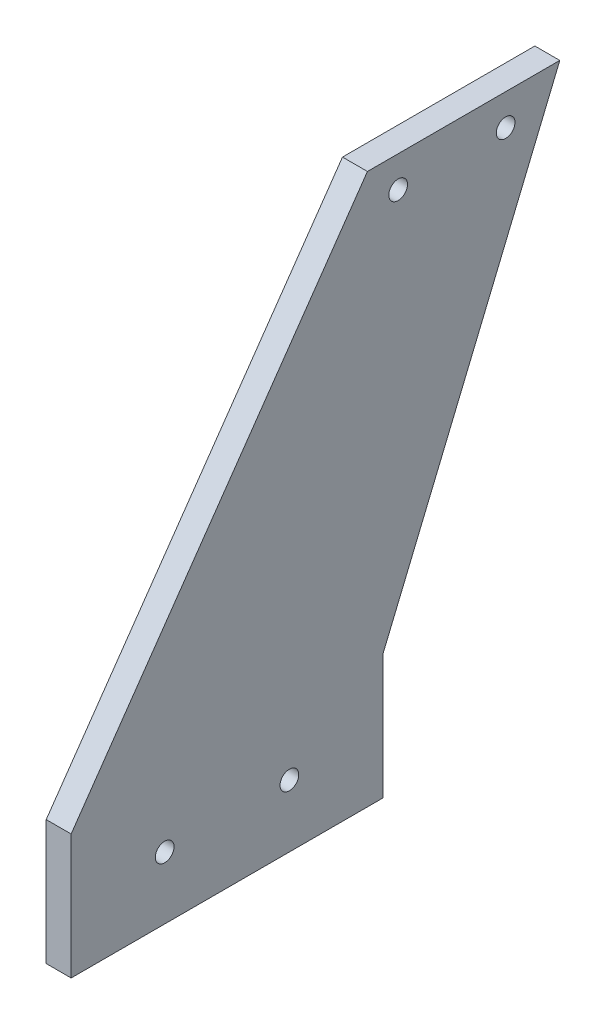
ISO-10303-21;
HEADER;
FILE_DESCRIPTION(('STEP AP214'),'2;1');
FILE_NAME('part.step','',(''),(''),'','','');
FILE_SCHEMA(('AUTOMOTIVE_DESIGN { 1 0 10303 214 1 1 1 1 }'));
ENDSEC;
DATA;
#1=APPLICATION_CONTEXT('core data for automotive mechanical design processes');
#2=APPLICATION_PROTOCOL_DEFINITION('international standard','automotive_design',2000,#1);
#3=PRODUCT_CONTEXT('',#1,'mechanical');
#4=PRODUCT('Part','Part','',(#3));
#5=PRODUCT_RELATED_PRODUCT_CATEGORY('part','',(#4));
#6=PRODUCT_DEFINITION_FORMATION('','',#4);
#7=PRODUCT_DEFINITION_CONTEXT('part definition',#1,'design');
#8=PRODUCT_DEFINITION('design','',#6,#7);
#9=PRODUCT_DEFINITION_SHAPE('','',#8);
#10=(LENGTH_UNIT() NAMED_UNIT(*) SI_UNIT(.MILLI.,.METRE.));
#11=(NAMED_UNIT(*) PLANE_ANGLE_UNIT() SI_UNIT($,.RADIAN.));
#12=(NAMED_UNIT(*) SI_UNIT($,.STERADIAN.) SOLID_ANGLE_UNIT());
#13=UNCERTAINTY_MEASURE_WITH_UNIT(LENGTH_MEASURE(1.E-05),#10,'distance_accuracy_value','');
#14=(GEOMETRIC_REPRESENTATION_CONTEXT(3) GLOBAL_UNCERTAINTY_ASSIGNED_CONTEXT((#13)) GLOBAL_UNIT_ASSIGNED_CONTEXT((#10,
#11,#12)) REPRESENTATION_CONTEXT('',''));
#15=CARTESIAN_POINT('',(0.,0.,0.));
#16=DIRECTION('',(0.,0.,1.));
#17=DIRECTION('',(1.,0.,0.));
#18=AXIS2_PLACEMENT_3D('',#15,#16,#17);
#19=CARTESIAN_POINT('',(4.,8.60297789126769,-81.777509309672));
#20=DIRECTION('',(0.,0.383750829564609,0.923436679371398));
#21=DIRECTION('',(0.,-0.923436679371398,0.383750829564609));
#22=AXIS2_PLACEMENT_3D('',#19,#20,#21);
#23=PLANE('',#22);
#24=DIRECTION('',(0.,0.923436679371398,-0.383750829564609));
#25=VECTOR('',#24,1.);
#26=CARTESIAN_POINT('',(0.,8.60297789126769,-81.777509309672));
#27=LINE('',#26,#25);
#28=CARTESIAN_POINT('',(0.,8.60297789126769,-81.777509309672));
#29=VERTEX_POINT('',#28);
#30=CARTESIAN_POINT('',(0.,76.856040612852,-110.141305144123));
#31=VERTEX_POINT('',#30);
#32=EDGE_CURVE('E119',#29,#31,#27,.T.);
#33=ORIENTED_EDGE('',*,*,#32,.T.);
#34=DIRECTION('',(-1.,0.,0.));
#35=VECTOR('',#34,1.);
#36=CARTESIAN_POINT('',(4.,76.856040612852,-110.141305144123));
#37=LINE('',#36,#35);
#38=CARTESIAN_POINT('',(4.,76.856040612852,-110.141305144123));
#39=VERTEX_POINT('',#38);
#40=EDGE_CURVE('E11',#39,#31,#37,.T.);
#41=ORIENTED_EDGE('',*,*,#40,.F.);
#42=DIRECTION('',(0.,0.923436679371398,-0.383750829564609));
#43=VECTOR('',#42,1.);
#44=CARTESIAN_POINT('',(4.,8.60297789126769,-81.777509309672));
#45=LINE('',#44,#43);
#46=CARTESIAN_POINT('',(4.,8.60297789126769,-81.777509309672));
#47=VERTEX_POINT('',#46);
#48=EDGE_CURVE('E130',#47,#39,#45,.T.);
#49=ORIENTED_EDGE('',*,*,#48,.F.);
#50=DIRECTION('',(-1.,0.,0.));
#51=VECTOR('',#50,1.);
#52=CARTESIAN_POINT('',(4.,8.60297789126769,-81.777509309672));
#53=LINE('',#52,#51);
#54=EDGE_CURVE('E115',#47,#29,#53,.T.);
#55=ORIENTED_EDGE('',*,*,#54,.T.);
#56=EDGE_LOOP('',(#33,#41,#49,#55));
#57=FACE_BOUND('',#56,.T.);
#58=ADVANCED_FACE('F33',(#57),#23,.F.);
#59=CARTESIAN_POINT('',(4.,76.856040612852,-110.141305144123));
#60=DIRECTION('',(0.,-1.,0.));
#61=DIRECTION('',(0.,0.,-1.));
#62=AXIS2_PLACEMENT_3D('',#59,#60,#61);
#63=PLANE('',#62);
#64=DIRECTION('',(0.,0.,1.));
#65=VECTOR('',#64,1.);
#66=CARTESIAN_POINT('',(0.,76.856040612852,-110.141305144123));
#67=LINE('',#66,#65);
#68=CARTESIAN_POINT('',(0.,76.856040612852,-79.2916593433676));
#69=VERTEX_POINT('',#68);
#70=EDGE_CURVE('E122',#31,#69,#67,.T.);
#71=ORIENTED_EDGE('',*,*,#70,.T.);
#72=DIRECTION('',(-1.,0.,0.));
#73=VECTOR('',#72,1.);
#74=CARTESIAN_POINT('',(4.,76.856040612852,-79.2916593433676));
#75=LINE('',#74,#73);
#76=CARTESIAN_POINT('',(4.,76.856040612852,-79.2916593433676));
#77=VERTEX_POINT('',#76);
#78=EDGE_CURVE('E42',#77,#69,#75,.T.);
#79=ORIENTED_EDGE('',*,*,#78,.F.);
#80=DIRECTION('',(0.,0.,1.));
#81=VECTOR('',#80,1.);
#82=CARTESIAN_POINT('',(4.,76.856040612852,-110.141305144123));
#83=LINE('',#82,#81);
#84=EDGE_CURVE('E88',#39,#77,#83,.T.);
#85=ORIENTED_EDGE('',*,*,#84,.F.);
#86=ORIENTED_EDGE('',*,*,#40,.T.);
#87=EDGE_LOOP('',(#71,#79,#85,#86));
#88=FACE_BOUND('',#87,.T.);
#89=ADVANCED_FACE('F151',(#88),#63,.F.);
#90=CARTESIAN_POINT('',(4.,8.60297789126769,-31.777509309672));
#91=DIRECTION('',(0.,-0.571338008732468,-0.820714858996484));
#92=DIRECTION('',(0.,0.820714858996484,-0.571338008732468));
#93=AXIS2_PLACEMENT_3D('',#90,#91,#92);
#94=PLANE('',#93);
#95=DIRECTION('',(0.,-0.820714858996484,0.571338008732468));
#96=VECTOR('',#95,1.);
#97=CARTESIAN_POINT('',(0.,8.60297789126769,-31.777509309672));
#98=LINE('',#97,#96);
#99=CARTESIAN_POINT('',(0.,8.60297789126769,-31.777509309672));
#100=VERTEX_POINT('',#99);
#101=EDGE_CURVE('E125',#69,#100,#98,.T.);
#102=ORIENTED_EDGE('',*,*,#101,.T.);
#103=DIRECTION('',(-1.,0.,0.));
#104=VECTOR('',#103,1.);
#105=CARTESIAN_POINT('',(4.,8.60297789126769,-31.777509309672));
#106=LINE('',#105,#104);
#107=CARTESIAN_POINT('',(4.,8.60297789126769,-31.777509309672));
#108=VERTEX_POINT('',#107);
#109=EDGE_CURVE('E110',#108,#100,#106,.T.);
#110=ORIENTED_EDGE('',*,*,#109,.F.);
#111=DIRECTION('',(0.,-0.820714858996484,0.571338008732468));
#112=VECTOR('',#111,1.);
#113=CARTESIAN_POINT('',(4.,8.60297789126769,-31.777509309672));
#114=LINE('',#113,#112);
#115=EDGE_CURVE('E101',#77,#108,#114,.T.);
#116=ORIENTED_EDGE('',*,*,#115,.F.);
#117=ORIENTED_EDGE('',*,*,#78,.T.);
#118=EDGE_LOOP('',(#102,#110,#116,#117));
#119=FACE_BOUND('',#118,.T.);
#120=ADVANCED_FACE('F154',(#119),#94,.F.);
#121=CARTESIAN_POINT('',(4.,-11.3970221087323,-31.777509309672));
#122=DIRECTION('',(0.,0.,-1.));
#123=DIRECTION('',(-1.,0.,0.));
#124=AXIS2_PLACEMENT_3D('',#121,#122,#123);
#125=PLANE('',#124);
#126=DIRECTION('',(0.,-1.,0.));
#127=VECTOR('',#126,1.);
#128=CARTESIAN_POINT('',(0.,-11.3970221087323,-31.777509309672));
#129=LINE('',#128,#127);
#130=CARTESIAN_POINT('',(0.,-11.3970221087323,-31.777509309672));
#131=VERTEX_POINT('',#130);
#132=EDGE_CURVE('E109',#100,#131,#129,.T.);
#133=ORIENTED_EDGE('',*,*,#132,.T.);
#134=DIRECTION('',(-1.,0.,0.));
#135=VECTOR('',#134,1.);
#136=CARTESIAN_POINT('',(4.,-11.3970221087323,-31.777509309672));
#137=LINE('',#136,#135);
#138=CARTESIAN_POINT('',(4.,-11.3970221087323,-31.777509309672));
#139=VERTEX_POINT('',#138);
#140=EDGE_CURVE('E106',#139,#131,#137,.T.);
#141=ORIENTED_EDGE('',*,*,#140,.F.);
#142=DIRECTION('',(0.,-1.,0.));
#143=VECTOR('',#142,1.);
#144=CARTESIAN_POINT('',(4.,-11.3970221087323,-31.777509309672));
#145=LINE('',#144,#143);
#146=EDGE_CURVE('E95',#108,#139,#145,.T.);
#147=ORIENTED_EDGE('',*,*,#146,.F.);
#148=ORIENTED_EDGE('',*,*,#109,.T.);
#149=EDGE_LOOP('',(#133,#141,#147,#148));
#150=FACE_BOUND('',#149,.T.);
#151=ADVANCED_FACE('F107',(#150),#125,.F.);
#152=CARTESIAN_POINT('',(4.,-11.3970221087323,-81.777509309672));
#153=DIRECTION('',(0.,1.,0.));
#154=DIRECTION('',(0.,0.,1.));
#155=AXIS2_PLACEMENT_3D('',#152,#153,#154);
#156=PLANE('',#155);
#157=DIRECTION('',(0.,0.,-1.));
#158=VECTOR('',#157,1.);
#159=CARTESIAN_POINT('',(0.,-11.3970221087323,-81.777509309672));
#160=LINE('',#159,#158);
#161=CARTESIAN_POINT('',(0.,-11.3970221087323,-81.777509309672));
#162=VERTEX_POINT('',#161);
#163=EDGE_CURVE('E74',#131,#162,#160,.T.);
#164=ORIENTED_EDGE('',*,*,#163,.T.);
#165=DIRECTION('',(-1.,0.,0.));
#166=VECTOR('',#165,1.);
#167=CARTESIAN_POINT('',(4.,-11.3970221087323,-81.777509309672));
#168=LINE('',#167,#166);
#169=CARTESIAN_POINT('',(4.,-11.3970221087323,-81.777509309672));
#170=VERTEX_POINT('',#169);
#171=EDGE_CURVE('E111',#170,#162,#168,.T.);
#172=ORIENTED_EDGE('',*,*,#171,.F.);
#173=DIRECTION('',(0.,0.,-1.));
#174=VECTOR('',#173,1.);
#175=CARTESIAN_POINT('',(4.,-11.3970221087323,-81.777509309672));
#176=LINE('',#175,#174);
#177=EDGE_CURVE('E99',#139,#170,#176,.T.);
#178=ORIENTED_EDGE('',*,*,#177,.F.);
#179=ORIENTED_EDGE('',*,*,#140,.T.);
#180=EDGE_LOOP('',(#164,#172,#178,#179));
#181=FACE_BOUND('',#180,.T.);
#182=ADVANCED_FACE('F113',(#181),#156,.F.);
#183=CARTESIAN_POINT('',(4.,8.60297789126769,-81.777509309672));
#184=DIRECTION('',(0.,0.,1.));
#185=DIRECTION('',(1.,0.,0.));
#186=AXIS2_PLACEMENT_3D('',#183,#184,#185);
#187=PLANE('',#186);
#188=DIRECTION('',(0.,1.,0.));
#189=VECTOR('',#188,1.);
#190=CARTESIAN_POINT('',(0.,8.60297789126769,-81.777509309672));
#191=LINE('',#190,#189);
#192=EDGE_CURVE('E80',#162,#29,#191,.T.);
#193=ORIENTED_EDGE('',*,*,#192,.T.);
#194=ORIENTED_EDGE('',*,*,#54,.F.);
#195=DIRECTION('',(0.,1.,0.));
#196=VECTOR('',#195,1.);
#197=CARTESIAN_POINT('',(4.,8.60297789126769,-81.777509309672));
#198=LINE('',#197,#196);
#199=EDGE_CURVE('E51',#170,#47,#198,.T.);
#200=ORIENTED_EDGE('',*,*,#199,.F.);
#201=ORIENTED_EDGE('',*,*,#171,.T.);
#202=EDGE_LOOP('',(#193,#194,#200,#201));
#203=FACE_BOUND('',#202,.T.);
#204=ADVANCED_FACE('F159',(#203),#187,.F.);
#205=CARTESIAN_POINT('',(4.,0.,0.));
#206=DIRECTION('',(1.,0.,0.));
#207=DIRECTION('',(0.,0.,-1.));
#208=AXIS2_PLACEMENT_3D('',#205,#206,#207);
#209=PLANE('',#208);
#210=CARTESIAN_POINT('',(4.,-1.39702210873231,-46.777509309672));
#211=DIRECTION('',(1.,0.,0.));
#212=DIRECTION('',(0.,0.,-1.));
#213=AXIS2_PLACEMENT_3D('',#210,#211,#212);
#214=CIRCLE('',#213,1.5);
#215=CARTESIAN_POINT('',(4.,-1.39702210873231,-48.277509309672));
#216=VERTEX_POINT('',#215);
#217=EDGE_CURVE('E252',#216,#216,#214,.T.);
#218=ORIENTED_EDGE('',*,*,#217,.F.);
#219=EDGE_LOOP('',(#218));
#220=FACE_BOUND('',#219,.T.);
#221=CARTESIAN_POINT('',(4.,-1.39702210873231,-66.777509309672));
#222=DIRECTION('',(1.,0.,0.));
#223=DIRECTION('',(0.,0.,-1.));
#224=AXIS2_PLACEMENT_3D('',#221,#222,#223);
#225=CIRCLE('',#224,1.5);
#226=CARTESIAN_POINT('',(4.,-1.39702210873231,-68.277509309672));
#227=VERTEX_POINT('',#226);
#228=EDGE_CURVE('E261',#227,#227,#225,.T.);
#229=ORIENTED_EDGE('',*,*,#228,.F.);
#230=EDGE_LOOP('',(#229));
#231=FACE_BOUND('',#230,.T.);
#232=CARTESIAN_POINT('',(4.,71.856040612852,-101.452703982698));
#233=DIRECTION('',(1.,0.,0.));
#234=DIRECTION('',(0.,0.,-1.));
#235=AXIS2_PLACEMENT_3D('',#232,#233,#234);
#236=CIRCLE('',#235,1.5);
#237=CARTESIAN_POINT('',(4.,71.856040612852,-102.952703982698));
#238=VERTEX_POINT('',#237);
#239=EDGE_CURVE('E144',#238,#238,#236,.T.);
#240=ORIENTED_EDGE('',*,*,#239,.F.);
#241=EDGE_LOOP('',(#240));
#242=FACE_BOUND('',#241,.T.);
#243=CARTESIAN_POINT('',(4.,71.856040612852,-84.2148408774012));
#244=DIRECTION('',(1.,0.,0.));
#245=DIRECTION('',(0.,0.,-1.));
#246=AXIS2_PLACEMENT_3D('',#243,#244,#245);
#247=CIRCLE('',#246,1.49999999999998);
#248=CARTESIAN_POINT('',(4.,71.856040612852,-85.7148408774012));
#249=VERTEX_POINT('',#248);
#250=EDGE_CURVE('E136',#249,#249,#247,.T.);
#251=ORIENTED_EDGE('',*,*,#250,.F.);
#252=EDGE_LOOP('',(#251));
#253=FACE_BOUND('',#252,.T.);
#254=ORIENTED_EDGE('',*,*,#48,.T.);
#255=ORIENTED_EDGE('',*,*,#84,.T.);
#256=ORIENTED_EDGE('',*,*,#115,.T.);
#257=ORIENTED_EDGE('',*,*,#146,.T.);
#258=ORIENTED_EDGE('',*,*,#177,.T.);
#259=ORIENTED_EDGE('',*,*,#199,.T.);
#260=EDGE_LOOP('',(#254,#255,#256,#257,#258,#259));
#261=FACE_BOUND('',#260,.T.);
#262=ADVANCED_FACE('F97',(#220,#231,#242,#253,#261),#209,.T.);
#263=CARTESIAN_POINT('',(0.,0.,0.));
#264=DIRECTION('',(1.,0.,0.));
#265=DIRECTION('',(0.,0.,-1.));
#266=AXIS2_PLACEMENT_3D('',#263,#264,#265);
#267=PLANE('',#266);
#268=CARTESIAN_POINT('',(0.,-1.39702210873231,-46.777509309672));
#269=DIRECTION('',(-1.,0.,0.));
#270=DIRECTION('',(0.,0.,1.));
#271=AXIS2_PLACEMENT_3D('',#268,#269,#270);
#272=CIRCLE('',#271,1.5);
#273=CARTESIAN_POINT('',(0.,-1.39702210873231,-45.277509309672));
#274=VERTEX_POINT('',#273);
#275=EDGE_CURVE('E255',#274,#274,#272,.T.);
#276=ORIENTED_EDGE('',*,*,#275,.F.);
#277=EDGE_LOOP('',(#276));
#278=FACE_BOUND('',#277,.T.);
#279=CARTESIAN_POINT('',(0.,-1.39702210873231,-66.777509309672));
#280=DIRECTION('',(-1.,0.,0.));
#281=DIRECTION('',(0.,0.,1.));
#282=AXIS2_PLACEMENT_3D('',#279,#280,#281);
#283=CIRCLE('',#282,1.5);
#284=CARTESIAN_POINT('',(0.,-1.39702210873231,-65.277509309672));
#285=VERTEX_POINT('',#284);
#286=EDGE_CURVE('E257',#285,#285,#283,.T.);
#287=ORIENTED_EDGE('',*,*,#286,.F.);
#288=EDGE_LOOP('',(#287));
#289=FACE_BOUND('',#288,.T.);
#290=CARTESIAN_POINT('',(0.,71.856040612852,-101.452703982698));
#291=DIRECTION('',(1.,0.,0.));
#292=DIRECTION('',(0.,0.,-1.));
#293=AXIS2_PLACEMENT_3D('',#290,#291,#292);
#294=CIRCLE('',#293,1.5);
#295=CARTESIAN_POINT('',(0.,71.856040612852,-102.952703982698));
#296=VERTEX_POINT('',#295);
#297=EDGE_CURVE('E36',#296,#296,#294,.T.);
#298=ORIENTED_EDGE('',*,*,#297,.T.);
#299=EDGE_LOOP('',(#298));
#300=FACE_BOUND('',#299,.T.);
#301=CARTESIAN_POINT('',(0.,71.856040612852,-84.2148408774012));
#302=DIRECTION('',(1.,0.,0.));
#303=DIRECTION('',(0.,0.,-1.));
#304=AXIS2_PLACEMENT_3D('',#301,#302,#303);
#305=CIRCLE('',#304,1.49999999999998);
#306=CARTESIAN_POINT('',(0.,71.856040612852,-85.7148408774012));
#307=VERTEX_POINT('',#306);
#308=EDGE_CURVE('E123',#307,#307,#305,.T.);
#309=ORIENTED_EDGE('',*,*,#308,.T.);
#310=EDGE_LOOP('',(#309));
#311=FACE_BOUND('',#310,.T.);
#312=ORIENTED_EDGE('',*,*,#32,.F.);
#313=ORIENTED_EDGE('',*,*,#192,.F.);
#314=ORIENTED_EDGE('',*,*,#163,.F.);
#315=ORIENTED_EDGE('',*,*,#132,.F.);
#316=ORIENTED_EDGE('',*,*,#101,.F.);
#317=ORIENTED_EDGE('',*,*,#70,.F.);
#318=EDGE_LOOP('',(#312,#313,#314,#315,#316,#317));
#319=FACE_BOUND('',#318,.T.);
#320=ADVANCED_FACE('F157',(#278,#289,#300,#311,#319),#267,.F.);
#321=CARTESIAN_POINT('',(-9.,71.856040612852,-84.2148408774012));
#322=DIRECTION('',(1.,0.,0.));
#323=DIRECTION('',(0.,0.,-1.));
#324=AXIS2_PLACEMENT_3D('',#321,#322,#323);
#325=CYLINDRICAL_SURFACE('',#324,1.49999999999998);
#326=ORIENTED_EDGE('',*,*,#250,.T.);
#327=EDGE_LOOP('',(#326));
#328=FACE_BOUND('',#327,.T.);
#329=ORIENTED_EDGE('',*,*,#308,.F.);
#330=EDGE_LOOP('',(#329));
#331=FACE_BOUND('',#330,.T.);
#332=ADVANCED_FACE('F198',(#328,#331),#325,.F.);
#333=CARTESIAN_POINT('',(-9.,71.856040612852,-101.452703982698));
#334=DIRECTION('',(1.,0.,0.));
#335=DIRECTION('',(0.,0.,-1.));
#336=AXIS2_PLACEMENT_3D('',#333,#334,#335);
#337=CYLINDRICAL_SURFACE('',#336,1.5);
#338=ORIENTED_EDGE('',*,*,#239,.T.);
#339=EDGE_LOOP('',(#338));
#340=FACE_BOUND('',#339,.T.);
#341=ORIENTED_EDGE('',*,*,#297,.F.);
#342=EDGE_LOOP('',(#341));
#343=FACE_BOUND('',#342,.T.);
#344=ADVANCED_FACE('F203',(#340,#343),#337,.F.);
#345=CARTESIAN_POINT('',(23.,-1.39702210873231,-66.777509309672));
#346=DIRECTION('',(-1.,0.,0.));
#347=DIRECTION('',(0.,0.,1.));
#348=AXIS2_PLACEMENT_3D('',#345,#346,#347);
#349=CYLINDRICAL_SURFACE('',#348,1.5);
#350=ORIENTED_EDGE('',*,*,#228,.T.);
#351=EDGE_LOOP('',(#350));
#352=FACE_BOUND('',#351,.T.);
#353=ORIENTED_EDGE('',*,*,#286,.T.);
#354=EDGE_LOOP('',(#353));
#355=FACE_BOUND('',#354,.T.);
#356=ADVANCED_FACE('F214',(#352,#355),#349,.F.);
#357=CARTESIAN_POINT('',(23.,-1.39702210873231,-46.777509309672));
#358=DIRECTION('',(-1.,0.,0.));
#359=DIRECTION('',(0.,0.,1.));
#360=AXIS2_PLACEMENT_3D('',#357,#358,#359);
#361=CYLINDRICAL_SURFACE('',#360,1.5);
#362=ORIENTED_EDGE('',*,*,#217,.T.);
#363=EDGE_LOOP('',(#362));
#364=FACE_BOUND('',#363,.T.);
#365=ORIENTED_EDGE('',*,*,#275,.T.);
#366=EDGE_LOOP('',(#365));
#367=FACE_BOUND('',#366,.T.);
#368=ADVANCED_FACE('F235',(#364,#367),#361,.F.);
#369=CLOSED_SHELL('',(#58,#89,#120,#151,#182,#204,#262,#320,#332,#344,#356,#368));
#370=MANIFOLD_SOLID_BREP('B2',#369);
#371=ADVANCED_BREP_SHAPE_REPRESENTATION('',(#18,#370),#14);
#372=SHAPE_DEFINITION_REPRESENTATION(#9,#371);
ENDSEC;
END-ISO-10303-21;
